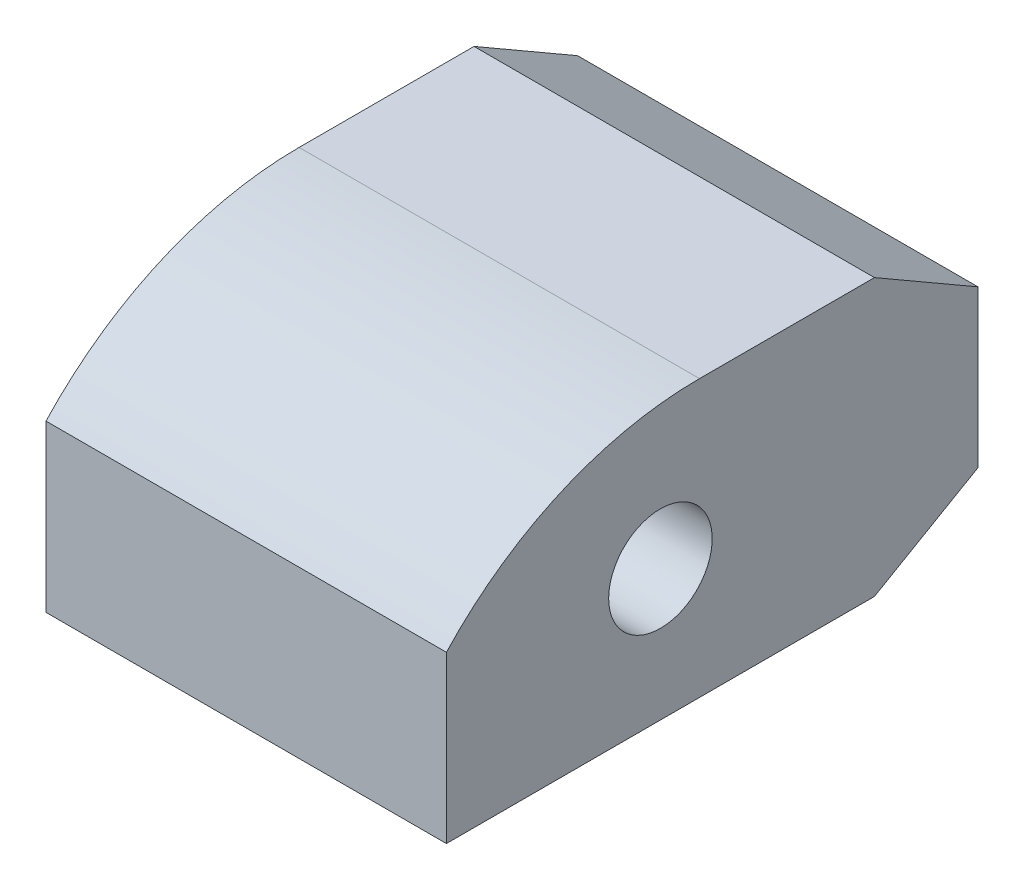
ISO-10303-21;
HEADER;
FILE_DESCRIPTION(('STEP AP214'),'2;1');
FILE_NAME('part.step','',(''),(''),'','','');
FILE_SCHEMA(('AUTOMOTIVE_DESIGN { 1 0 10303 214 1 1 1 1 }'));
ENDSEC;
DATA;
#1=APPLICATION_CONTEXT('core data for automotive mechanical design processes');
#2=APPLICATION_PROTOCOL_DEFINITION('international standard','automotive_design',2000,#1);
#3=PRODUCT_CONTEXT('',#1,'mechanical');
#4=PRODUCT('Part','Part','',(#3));
#5=PRODUCT_RELATED_PRODUCT_CATEGORY('part','',(#4));
#6=PRODUCT_DEFINITION_FORMATION('','',#4);
#7=PRODUCT_DEFINITION_CONTEXT('part definition',#1,'design');
#8=PRODUCT_DEFINITION('design','',#6,#7);
#9=PRODUCT_DEFINITION_SHAPE('','',#8);
#10=(LENGTH_UNIT() NAMED_UNIT(*) SI_UNIT(.MILLI.,.METRE.));
#11=(NAMED_UNIT(*) PLANE_ANGLE_UNIT() SI_UNIT($,.RADIAN.));
#12=(NAMED_UNIT(*) SI_UNIT($,.STERADIAN.) SOLID_ANGLE_UNIT());
#13=UNCERTAINTY_MEASURE_WITH_UNIT(LENGTH_MEASURE(1.E-05),#10,'distance_accuracy_value','');
#14=(GEOMETRIC_REPRESENTATION_CONTEXT(3) GLOBAL_UNCERTAINTY_ASSIGNED_CONTEXT((#13)) GLOBAL_UNIT_ASSIGNED_CONTEXT((#10,
#11,#12)) REPRESENTATION_CONTEXT('',''));
#15=CARTESIAN_POINT('',(0.,0.,0.));
#16=DIRECTION('',(0.,0.,1.));
#17=DIRECTION('',(1.,0.,0.));
#18=AXIS2_PLACEMENT_3D('',#15,#16,#17);
#19=CARTESIAN_POINT('',(29.,-29.,-5.66060555964671));
#20=DIRECTION('',(1.,0.,0.));
#21=DIRECTION('',(0.,0.,-1.));
#22=AXIS2_PLACEMENT_3D('',#19,#20,#21);
#23=PLANE('',#22);
#24=CARTESIAN_POINT('',(29.,-29.,-5.66060555964671));
#25=DIRECTION('',(1.,0.,0.));
#26=DIRECTION('',(0.,0.,-1.));
#27=AXIS2_PLACEMENT_3D('',#24,#25,#26);
#28=CIRCLE('',#27,50.);
#29=CARTESIAN_POINT('',(29.,21.,-5.66060555964671));
#30=VERTEX_POINT('',#29);
#31=CARTESIAN_POINT('',(29.,5.,31.));
#32=VERTEX_POINT('',#31);
#33=EDGE_CURVE('E159',#30,#32,#28,.T.);
#34=ORIENTED_EDGE('',*,*,#33,.T.);
#35=DIRECTION('',(0.,-1.,0.));
#36=VECTOR('',#35,1.);
#37=CARTESIAN_POINT('',(29.,5.,31.));
#38=LINE('',#37,#36);
#39=CARTESIAN_POINT('',(29.,-19.,31.));
#40=VERTEX_POINT('',#39);
#41=EDGE_CURVE('E101',#32,#40,#38,.T.);
#42=ORIENTED_EDGE('',*,*,#41,.T.);
#43=DIRECTION('',(0.,0.,-1.));
#44=VECTOR('',#43,1.);
#45=CARTESIAN_POINT('',(29.,-19.,31.));
#46=LINE('',#45,#44);
#47=CARTESIAN_POINT('',(29.,-19.,-31.));
#48=VERTEX_POINT('',#47);
#49=EDGE_CURVE('E176',#40,#48,#46,.T.);
#50=ORIENTED_EDGE('',*,*,#49,.T.);
#51=DIRECTION('',(0.,0.500000000000001,-0.866025403784438));
#52=VECTOR('',#51,1.);
#53=CARTESIAN_POINT('',(29.,-19.,-31.));
#54=LINE('',#53,#52);
#55=CARTESIAN_POINT('',(29.,-10.3397459621556,-46.));
#56=VERTEX_POINT('',#55);
#57=EDGE_CURVE('E117',#48,#56,#54,.T.);
#58=ORIENTED_EDGE('',*,*,#57,.T.);
#59=DIRECTION('',(0.,1.,0.));
#60=VECTOR('',#59,1.);
#61=CARTESIAN_POINT('',(29.,-10.3397459621556,-46.));
#62=LINE('',#61,#60);
#63=CARTESIAN_POINT('',(29.,12.3397459621556,-46.));
#64=VERTEX_POINT('',#63);
#65=EDGE_CURVE('E111',#56,#64,#62,.T.);
#66=ORIENTED_EDGE('',*,*,#65,.T.);
#67=DIRECTION('',(0.,0.500000000000001,0.866025403784438));
#68=VECTOR('',#67,1.);
#69=CARTESIAN_POINT('',(29.,12.3397459621556,-46.));
#70=LINE('',#69,#68);
#71=CARTESIAN_POINT('',(29.,21.,-31.));
#72=VERTEX_POINT('',#71);
#73=EDGE_CURVE('E115',#64,#72,#70,.T.);
#74=ORIENTED_EDGE('',*,*,#73,.T.);
#75=DIRECTION('',(0.,0.,1.));
#76=VECTOR('',#75,1.);
#77=CARTESIAN_POINT('',(29.,21.,-31.));
#78=LINE('',#77,#76);
#79=EDGE_CURVE('E61',#72,#30,#78,.T.);
#80=ORIENTED_EDGE('',*,*,#79,.T.);
#81=EDGE_LOOP('',(#34,#42,#50,#58,#66,#74,#80));
#82=FACE_BOUND('',#81,.T.);
#83=CARTESIAN_POINT('',(29.,0.,0.));
#84=DIRECTION('',(1.,0.,0.));
#85=DIRECTION('',(0.,0.,-1.));
#86=AXIS2_PLACEMENT_3D('',#83,#84,#85);
#87=CIRCLE('',#86,7.5);
#88=CARTESIAN_POINT('',(29.,0.,7.5));
#89=VERTEX_POINT('',#88);
#90=EDGE_CURVE('E144',#89,#89,#87,.T.);
#91=ORIENTED_EDGE('',*,*,#90,.F.);
#92=EDGE_LOOP('',(#91));
#93=FACE_BOUND('',#92,.T.);
#94=ADVANCED_FACE('F43',(#82,#93),#23,.T.);
#95=CARTESIAN_POINT('',(-29.,-29.,-5.66060555964671));
#96=DIRECTION('',(1.,0.,0.));
#97=DIRECTION('',(0.,0.,-1.));
#98=AXIS2_PLACEMENT_3D('',#95,#96,#97);
#99=PLANE('',#98);
#100=CARTESIAN_POINT('',(-29.,-29.,-5.66060555964671));
#101=DIRECTION('',(1.,0.,0.));
#102=DIRECTION('',(0.,0.,-1.));
#103=AXIS2_PLACEMENT_3D('',#100,#101,#102);
#104=CIRCLE('',#103,50.);
#105=CARTESIAN_POINT('',(-29.,21.,-5.66060555964671));
#106=VERTEX_POINT('',#105);
#107=CARTESIAN_POINT('',(-29.,5.,31.));
#108=VERTEX_POINT('',#107);
#109=EDGE_CURVE('E139',#106,#108,#104,.T.);
#110=ORIENTED_EDGE('',*,*,#109,.F.);
#111=DIRECTION('',(0.,0.,1.));
#112=VECTOR('',#111,1.);
#113=CARTESIAN_POINT('',(-29.,21.,-31.));
#114=LINE('',#113,#112);
#115=CARTESIAN_POINT('',(-29.,21.,-31.));
#116=VERTEX_POINT('',#115);
#117=EDGE_CURVE('E93',#116,#106,#114,.T.);
#118=ORIENTED_EDGE('',*,*,#117,.F.);
#119=DIRECTION('',(0.,0.500000000000001,0.866025403784438));
#120=VECTOR('',#119,1.);
#121=CARTESIAN_POINT('',(-29.,12.3397459621556,-46.));
#122=LINE('',#121,#120);
#123=CARTESIAN_POINT('',(-29.,12.3397459621556,-46.));
#124=VERTEX_POINT('',#123);
#125=EDGE_CURVE('E87',#124,#116,#122,.T.);
#126=ORIENTED_EDGE('',*,*,#125,.F.);
#127=DIRECTION('',(0.,1.,0.));
#128=VECTOR('',#127,1.);
#129=CARTESIAN_POINT('',(-29.,-10.3397459621556,-46.));
#130=LINE('',#129,#128);
#131=CARTESIAN_POINT('',(-29.,-10.3397459621556,-46.));
#132=VERTEX_POINT('',#131);
#133=EDGE_CURVE('E126',#132,#124,#130,.T.);
#134=ORIENTED_EDGE('',*,*,#133,.F.);
#135=DIRECTION('',(0.,0.500000000000001,-0.866025403784438));
#136=VECTOR('',#135,1.);
#137=CARTESIAN_POINT('',(-29.,-19.,-31.));
#138=LINE('',#137,#136);
#139=CARTESIAN_POINT('',(-29.,-19.,-31.));
#140=VERTEX_POINT('',#139);
#141=EDGE_CURVE('E150',#140,#132,#138,.T.);
#142=ORIENTED_EDGE('',*,*,#141,.F.);
#143=DIRECTION('',(0.,0.,-1.));
#144=VECTOR('',#143,1.);
#145=CARTESIAN_POINT('',(-29.,-19.,31.));
#146=LINE('',#145,#144);
#147=CARTESIAN_POINT('',(-29.,-19.,31.));
#148=VERTEX_POINT('',#147);
#149=EDGE_CURVE('E147',#148,#140,#146,.T.);
#150=ORIENTED_EDGE('',*,*,#149,.F.);
#151=DIRECTION('',(0.,-1.,0.));
#152=VECTOR('',#151,1.);
#153=CARTESIAN_POINT('',(-29.,5.,31.));
#154=LINE('',#153,#152);
#155=EDGE_CURVE('E143',#108,#148,#154,.T.);
#156=ORIENTED_EDGE('',*,*,#155,.F.);
#157=EDGE_LOOP('',(#110,#118,#126,#134,#142,#150,#156));
#158=FACE_BOUND('',#157,.T.);
#159=CARTESIAN_POINT('',(-29.,0.,0.));
#160=DIRECTION('',(1.,0.,0.));
#161=DIRECTION('',(0.,0.,-1.));
#162=AXIS2_PLACEMENT_3D('',#159,#160,#161);
#163=CIRCLE('',#162,7.5);
#164=CARTESIAN_POINT('',(-29.,0.,7.5));
#165=VERTEX_POINT('',#164);
#166=EDGE_CURVE('E192',#165,#165,#163,.T.);
#167=ORIENTED_EDGE('',*,*,#166,.T.);
#168=EDGE_LOOP('',(#167));
#169=FACE_BOUND('',#168,.T.);
#170=ADVANCED_FACE('F180',(#158,#169),#99,.F.);
#171=CARTESIAN_POINT('',(29.,-29.,-5.66060555964671));
#172=DIRECTION('',(-1.,0.,0.));
#173=DIRECTION('',(0.,0.,1.));
#174=AXIS2_PLACEMENT_3D('',#171,#172,#173);
#175=CYLINDRICAL_SURFACE('',#174,50.);
#176=ORIENTED_EDGE('',*,*,#109,.T.);
#177=DIRECTION('',(-1.,0.,0.));
#178=VECTOR('',#177,1.);
#179=CARTESIAN_POINT('',(29.,5.,31.));
#180=LINE('',#179,#178);
#181=EDGE_CURVE('E11',#32,#108,#180,.T.);
#182=ORIENTED_EDGE('',*,*,#181,.F.);
#183=ORIENTED_EDGE('',*,*,#33,.F.);
#184=DIRECTION('',(-1.,0.,0.));
#185=VECTOR('',#184,1.);
#186=CARTESIAN_POINT('',(29.,21.,-5.66060555964671));
#187=LINE('',#186,#185);
#188=EDGE_CURVE('E135',#30,#106,#187,.T.);
#189=ORIENTED_EDGE('',*,*,#188,.T.);
#190=EDGE_LOOP('',(#176,#182,#183,#189));
#191=FACE_BOUND('',#190,.T.);
#192=ADVANCED_FACE('F45',(#191),#175,.T.);
#193=CARTESIAN_POINT('',(29.,5.,31.));
#194=DIRECTION('',(0.,0.,-1.));
#195=DIRECTION('',(-1.,0.,0.));
#196=AXIS2_PLACEMENT_3D('',#193,#194,#195);
#197=PLANE('',#196);
#198=ORIENTED_EDGE('',*,*,#155,.T.);
#199=DIRECTION('',(-1.,0.,0.));
#200=VECTOR('',#199,1.);
#201=CARTESIAN_POINT('',(29.,-19.,31.));
#202=LINE('',#201,#200);
#203=EDGE_CURVE('E53',#40,#148,#202,.T.);
#204=ORIENTED_EDGE('',*,*,#203,.F.);
#205=ORIENTED_EDGE('',*,*,#41,.F.);
#206=ORIENTED_EDGE('',*,*,#181,.T.);
#207=EDGE_LOOP('',(#198,#204,#205,#206));
#208=FACE_BOUND('',#207,.T.);
#209=ADVANCED_FACE('F220',(#208),#197,.F.);
#210=CARTESIAN_POINT('',(29.,-19.,31.));
#211=DIRECTION('',(0.,1.,0.));
#212=DIRECTION('',(0.,0.,1.));
#213=AXIS2_PLACEMENT_3D('',#210,#211,#212);
#214=PLANE('',#213);
#215=ORIENTED_EDGE('',*,*,#149,.T.);
#216=DIRECTION('',(-1.,0.,0.));
#217=VECTOR('',#216,1.);
#218=CARTESIAN_POINT('',(29.,-19.,-31.));
#219=LINE('',#218,#217);
#220=EDGE_CURVE('E166',#48,#140,#219,.T.);
#221=ORIENTED_EDGE('',*,*,#220,.F.);
#222=ORIENTED_EDGE('',*,*,#49,.F.);
#223=ORIENTED_EDGE('',*,*,#203,.T.);
#224=EDGE_LOOP('',(#215,#221,#222,#223));
#225=FACE_BOUND('',#224,.T.);
#226=ADVANCED_FACE('F174',(#225),#214,.F.);
#227=CARTESIAN_POINT('',(29.,-19.,-31.));
#228=DIRECTION('',(0.,0.866025403784438,0.500000000000001));
#229=DIRECTION('',(0.,-0.500000000000001,0.866025403784438));
#230=AXIS2_PLACEMENT_3D('',#227,#228,#229);
#231=PLANE('',#230);
#232=ORIENTED_EDGE('',*,*,#141,.T.);
#233=DIRECTION('',(-1.,0.,0.));
#234=VECTOR('',#233,1.);
#235=CARTESIAN_POINT('',(29.,-10.3397459621556,-46.));
#236=LINE('',#235,#234);
#237=EDGE_CURVE('E128',#56,#132,#236,.T.);
#238=ORIENTED_EDGE('',*,*,#237,.F.);
#239=ORIENTED_EDGE('',*,*,#57,.F.);
#240=ORIENTED_EDGE('',*,*,#220,.T.);
#241=EDGE_LOOP('',(#232,#238,#239,#240));
#242=FACE_BOUND('',#241,.T.);
#243=ADVANCED_FACE('F183',(#242),#231,.F.);
#244=CARTESIAN_POINT('',(29.,-10.3397459621556,-46.));
#245=DIRECTION('',(0.,0.,1.));
#246=DIRECTION('',(0.,-1.,0.));
#247=AXIS2_PLACEMENT_3D('',#244,#245,#246);
#248=PLANE('',#247);
#249=ORIENTED_EDGE('',*,*,#133,.T.);
#250=DIRECTION('',(-1.,0.,0.));
#251=VECTOR('',#250,1.);
#252=CARTESIAN_POINT('',(29.,12.3397459621556,-46.));
#253=LINE('',#252,#251);
#254=EDGE_CURVE('E123',#64,#124,#253,.T.);
#255=ORIENTED_EDGE('',*,*,#254,.F.);
#256=ORIENTED_EDGE('',*,*,#65,.F.);
#257=ORIENTED_EDGE('',*,*,#237,.T.);
#258=EDGE_LOOP('',(#249,#255,#256,#257));
#259=FACE_BOUND('',#258,.T.);
#260=ADVANCED_FACE('F124',(#259),#248,.F.);
#261=CARTESIAN_POINT('',(29.,12.3397459621556,-46.));
#262=DIRECTION('',(0.,-0.866025403784438,0.500000000000001));
#263=DIRECTION('',(0.,-0.500000000000001,-0.866025403784438));
#264=AXIS2_PLACEMENT_3D('',#261,#262,#263);
#265=PLANE('',#264);
#266=ORIENTED_EDGE('',*,*,#125,.T.);
#267=DIRECTION('',(-1.,0.,0.));
#268=VECTOR('',#267,1.);
#269=CARTESIAN_POINT('',(29.,21.,-31.));
#270=LINE('',#269,#268);
#271=EDGE_CURVE('E129',#72,#116,#270,.T.);
#272=ORIENTED_EDGE('',*,*,#271,.F.);
#273=ORIENTED_EDGE('',*,*,#73,.F.);
#274=ORIENTED_EDGE('',*,*,#254,.T.);
#275=EDGE_LOOP('',(#266,#272,#273,#274));
#276=FACE_BOUND('',#275,.T.);
#277=ADVANCED_FACE('F131',(#276),#265,.F.);
#278=CARTESIAN_POINT('',(29.,21.,-31.));
#279=DIRECTION('',(0.,-1.,0.));
#280=DIRECTION('',(0.,0.,-1.));
#281=AXIS2_PLACEMENT_3D('',#278,#279,#280);
#282=PLANE('',#281);
#283=ORIENTED_EDGE('',*,*,#117,.T.);
#284=ORIENTED_EDGE('',*,*,#188,.F.);
#285=ORIENTED_EDGE('',*,*,#79,.F.);
#286=ORIENTED_EDGE('',*,*,#271,.T.);
#287=EDGE_LOOP('',(#283,#284,#285,#286));
#288=FACE_BOUND('',#287,.T.);
#289=ADVANCED_FACE('F210',(#288),#282,.F.);
#290=CARTESIAN_POINT('',(29.,0.,0.));
#291=DIRECTION('',(-1.,0.,0.));
#292=DIRECTION('',(0.,0.,1.));
#293=AXIS2_PLACEMENT_3D('',#290,#291,#292);
#294=CYLINDRICAL_SURFACE('',#293,7.5);
#295=CARTESIAN_POINT('',(29.,0.,7.5));
#296=CARTESIAN_POINT('',(28.3958333333333,0.,7.5));
#297=CARTESIAN_POINT('',(27.7916666666667,0.,7.5));
#298=CARTESIAN_POINT('',(26.5833333333333,0.,7.5));
#299=CARTESIAN_POINT('',(25.9791666666667,0.,7.5));
#300=CARTESIAN_POINT('',(24.7708333333333,0.,7.5));
#301=CARTESIAN_POINT('',(24.1666666666667,0.,7.5));
#302=CARTESIAN_POINT('',(22.9583333333333,0.,7.5));
#303=CARTESIAN_POINT('',(22.3541666666667,0.,7.5));
#304=CARTESIAN_POINT('',(21.1458333333333,0.,7.5));
#305=CARTESIAN_POINT('',(20.5416666666667,0.,7.5));
#306=CARTESIAN_POINT('',(19.3333333333333,0.,7.5));
#307=CARTESIAN_POINT('',(18.7291666666667,0.,7.5));
#308=CARTESIAN_POINT('',(17.5208333333333,0.,7.5));
#309=CARTESIAN_POINT('',(16.9166666666667,0.,7.5));
#310=CARTESIAN_POINT('',(15.7083333333333,0.,7.5));
#311=CARTESIAN_POINT('',(15.1041666666667,0.,7.5));
#312=CARTESIAN_POINT('',(13.8958333333333,0.,7.5));
#313=CARTESIAN_POINT('',(13.2916666666667,0.,7.5));
#314=CARTESIAN_POINT('',(12.0833333333333,0.,7.5));
#315=CARTESIAN_POINT('',(11.4791666666667,0.,7.5));
#316=CARTESIAN_POINT('',(10.2708333333333,0.,7.5));
#317=CARTESIAN_POINT('',(9.66666666666667,0.,7.5));
#318=CARTESIAN_POINT('',(8.45833333333333,0.,7.5));
#319=CARTESIAN_POINT('',(7.85416666666667,0.,7.5));
#320=CARTESIAN_POINT('',(6.64583333333333,0.,7.5));
#321=CARTESIAN_POINT('',(6.04166666666667,0.,7.5));
#322=CARTESIAN_POINT('',(4.83333333333333,0.,7.5));
#323=CARTESIAN_POINT('',(4.22916666666667,0.,7.5));
#324=CARTESIAN_POINT('',(3.02083333333333,0.,7.5));
#325=CARTESIAN_POINT('',(2.41666666666667,0.,7.5));
#326=CARTESIAN_POINT('',(1.20833333333333,0.,7.5));
#327=CARTESIAN_POINT('',(0.604166666666667,0.,7.5));
#328=CARTESIAN_POINT('',(-0.604166666666667,0.,7.5));
#329=CARTESIAN_POINT('',(-1.20833333333333,0.,7.5));
#330=CARTESIAN_POINT('',(-2.41666666666667,0.,7.5));
#331=CARTESIAN_POINT('',(-3.02083333333333,0.,7.5));
#332=CARTESIAN_POINT('',(-4.22916666666667,0.,7.5));
#333=CARTESIAN_POINT('',(-4.83333333333333,0.,7.5));
#334=CARTESIAN_POINT('',(-6.04166666666666,0.,7.5));
#335=CARTESIAN_POINT('',(-6.64583333333333,0.,7.5));
#336=CARTESIAN_POINT('',(-7.85416666666666,0.,7.5));
#337=CARTESIAN_POINT('',(-8.45833333333333,0.,7.5));
#338=CARTESIAN_POINT('',(-9.66666666666667,0.,7.5));
#339=CARTESIAN_POINT('',(-10.2708333333333,0.,7.5));
#340=CARTESIAN_POINT('',(-11.4791666666667,0.,7.5));
#341=CARTESIAN_POINT('',(-12.0833333333333,0.,7.5));
#342=CARTESIAN_POINT('',(-13.2916666666667,0.,7.5));
#343=CARTESIAN_POINT('',(-13.8958333333333,0.,7.5));
#344=CARTESIAN_POINT('',(-15.1041666666667,0.,7.5));
#345=CARTESIAN_POINT('',(-15.7083333333333,0.,7.5));
#346=CARTESIAN_POINT('',(-16.9166666666667,0.,7.5));
#347=CARTESIAN_POINT('',(-17.5208333333333,0.,7.5));
#348=CARTESIAN_POINT('',(-18.7291666666667,0.,7.5));
#349=CARTESIAN_POINT('',(-19.3333333333333,0.,7.5));
#350=CARTESIAN_POINT('',(-20.5416666666667,0.,7.5));
#351=CARTESIAN_POINT('',(-21.1458333333333,0.,7.5));
#352=CARTESIAN_POINT('',(-22.3541666666667,0.,7.5));
#353=CARTESIAN_POINT('',(-22.9583333333333,0.,7.5));
#354=CARTESIAN_POINT('',(-24.1666666666667,0.,7.5));
#355=CARTESIAN_POINT('',(-24.7708333333333,0.,7.5));
#356=CARTESIAN_POINT('',(-25.9791666666667,0.,7.5));
#357=CARTESIAN_POINT('',(-26.5833333333333,0.,7.5));
#358=CARTESIAN_POINT('',(-27.7916666666667,0.,7.5));
#359=CARTESIAN_POINT('',(-28.3958333333333,0.,7.5));
#360=CARTESIAN_POINT('',(-29.,0.,7.5));
#361=B_SPLINE_CURVE_WITH_KNOTS('',3,(#295,#296,#297,#298,#299,#300,#301,#302,#303,#304,#305,
#306,#307,#308,#309,#310,#311,#312,#313,#314,#315,#316,#317,#318,#319,#320,#321,#322,#323,#324,
#325,#326,#327,#328,#329,#330,#331,#332,#333,#334,#335,#336,#337,#338,#339,#340,#341,#342,#343,
#344,#345,#346,#347,#348,#349,#350,#351,#352,#353,#354,#355,#356,#357,#358,#359,#360),
.UNSPECIFIED.,.F.,.F.,(4,2,2,2,2,2,2,2,2,2,2,2,2,2,2,2,2,2,2,2,2,2,2,2,2,2,2,2,2,2,2,2,4),(0.,
1.8125,3.625,5.4375,7.25,9.0625,10.875,12.6875,14.5,16.3125,18.125,19.9375,21.75,23.5625,25.375,
27.1875,29.,30.8125,32.625,34.4375,36.25,38.0625,39.875,41.6875,43.5,45.3125,47.125,48.9375,
50.75,52.5625,54.375,56.1875,58.),.UNSPECIFIED.);
#362=EDGE_CURVE('BSEAM200',#89,#165,#361,.T.);
#363=ORIENTED_EDGE('',*,*,#90,.T.);
#364=ORIENTED_EDGE('',*,*,#166,.F.);
#365=ORIENTED_EDGE('',*,*,#362,.T.);
#366=ORIENTED_EDGE('',*,*,#362,.F.);
#367=EDGE_LOOP('',(#363,#365,#364,#366));
#368=FACE_BOUND('',#367,.T.);
#369=ADVANCED_FACE('F200',(#368),#294,.F.);
#370=CLOSED_SHELL('',(#94,#170,#192,#209,#226,#243,#260,#277,#289,#369));
#371=MANIFOLD_SOLID_BREP('B2',#370);
#372=ADVANCED_BREP_SHAPE_REPRESENTATION('',(#18,#371),#14);
#373=SHAPE_DEFINITION_REPRESENTATION(#9,#372);
ENDSEC;
END-ISO-10303-21;
